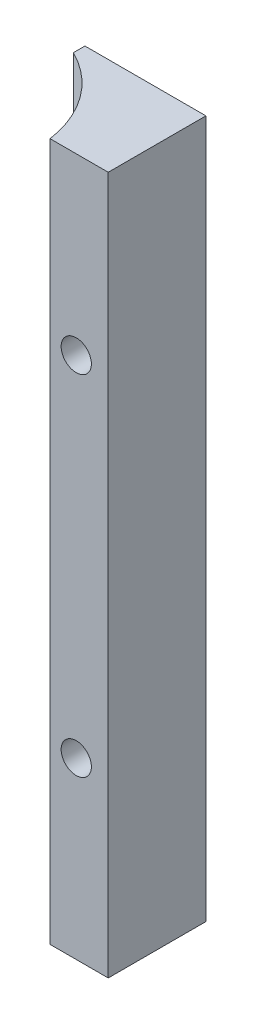
ISO-10303-21;
HEADER;
FILE_DESCRIPTION(('STEP AP214'),'2;1');
FILE_NAME('part.step','',(''),(''),'','','');
FILE_SCHEMA(('AUTOMOTIVE_DESIGN { 1 0 10303 214 1 1 1 1 }'));
ENDSEC;
DATA;
#1=APPLICATION_CONTEXT('core data for automotive mechanical design processes');
#2=APPLICATION_PROTOCOL_DEFINITION('international standard','automotive_design',2000,#1);
#3=PRODUCT_CONTEXT('',#1,'mechanical');
#4=PRODUCT('Part','Part','',(#3));
#5=PRODUCT_RELATED_PRODUCT_CATEGORY('part','',(#4));
#6=PRODUCT_DEFINITION_FORMATION('','',#4);
#7=PRODUCT_DEFINITION_CONTEXT('part definition',#1,'design');
#8=PRODUCT_DEFINITION('design','',#6,#7);
#9=PRODUCT_DEFINITION_SHAPE('','',#8);
#10=(LENGTH_UNIT() NAMED_UNIT(*) SI_UNIT(.MILLI.,.METRE.));
#11=(NAMED_UNIT(*) PLANE_ANGLE_UNIT() SI_UNIT($,.RADIAN.));
#12=(NAMED_UNIT(*) SI_UNIT($,.STERADIAN.) SOLID_ANGLE_UNIT());
#13=UNCERTAINTY_MEASURE_WITH_UNIT(LENGTH_MEASURE(1.E-05),#10,'distance_accuracy_value','');
#14=(GEOMETRIC_REPRESENTATION_CONTEXT(3) GLOBAL_UNCERTAINTY_ASSIGNED_CONTEXT((#13)) GLOBAL_UNIT_ASSIGNED_CONTEXT((#10,
#11,#12)) REPRESENTATION_CONTEXT('',''));
#15=CARTESIAN_POINT('',(0.,0.,0.));
#16=DIRECTION('',(0.,0.,1.));
#17=DIRECTION('',(1.,0.,0.));
#18=AXIS2_PLACEMENT_3D('',#15,#16,#17);
#19=CARTESIAN_POINT('',(-5.,60.,0.));
#20=DIRECTION('',(0.,0.,-1.));
#21=DIRECTION('',(-1.,0.,0.));
#22=AXIS2_PLACEMENT_3D('',#19,#20,#21);
#23=PLANE('',#22);
#24=CARTESIAN_POINT('',(-2.75,45.,0.));
#25=DIRECTION('',(0.,0.,1.));
#26=DIRECTION('',(1.,0.,0.));
#27=AXIS2_PLACEMENT_3D('',#24,#25,#26);
#28=CIRCLE('',#27,1.3);
#29=CARTESIAN_POINT('',(-1.45,45.,0.));
#30=VERTEX_POINT('',#29);
#31=EDGE_CURVE('E146',#30,#30,#28,.T.);
#32=ORIENTED_EDGE('',*,*,#31,.F.);
#33=EDGE_LOOP('',(#32));
#34=FACE_BOUND('',#33,.T.);
#35=CARTESIAN_POINT('',(-2.75,15.,0.));
#36=DIRECTION('',(0.,0.,1.));
#37=DIRECTION('',(1.,0.,0.));
#38=AXIS2_PLACEMENT_3D('',#35,#36,#37);
#39=CIRCLE('',#38,1.3);
#40=CARTESIAN_POINT('',(-1.45,15.,0.));
#41=VERTEX_POINT('',#40);
#42=EDGE_CURVE('E149',#41,#41,#39,.T.);
#43=ORIENTED_EDGE('',*,*,#42,.F.);
#44=EDGE_LOOP('',(#43));
#45=FACE_BOUND('',#44,.T.);
#46=DIRECTION('',(1.,0.,0.));
#47=VECTOR('',#46,1.);
#48=CARTESIAN_POINT('',(-5.,0.,0.));
#49=LINE('',#48,#47);
#50=CARTESIAN_POINT('',(-5.,0.,0.));
#51=VERTEX_POINT('',#50);
#52=CARTESIAN_POINT('',(0.,0.,0.));
#53=VERTEX_POINT('',#52);
#54=EDGE_CURVE('E110',#51,#53,#49,.T.);
#55=ORIENTED_EDGE('',*,*,#54,.T.);
#56=DIRECTION('',(0.,-1.,0.));
#57=VECTOR('',#56,1.);
#58=CARTESIAN_POINT('',(0.,60.,0.));
#59=LINE('',#58,#57);
#60=CARTESIAN_POINT('',(0.,60.,0.));
#61=VERTEX_POINT('',#60);
#62=EDGE_CURVE('E11',#61,#53,#59,.T.);
#63=ORIENTED_EDGE('',*,*,#62,.F.);
#64=DIRECTION('',(1.,0.,0.));
#65=VECTOR('',#64,1.);
#66=CARTESIAN_POINT('',(-5.,60.,0.));
#67=LINE('',#66,#65);
#68=CARTESIAN_POINT('',(-5.,60.,0.));
#69=VERTEX_POINT('',#68);
#70=EDGE_CURVE('E119',#69,#61,#67,.T.);
#71=ORIENTED_EDGE('',*,*,#70,.F.);
#72=DIRECTION('',(0.,-1.,0.));
#73=VECTOR('',#72,1.);
#74=CARTESIAN_POINT('',(-5.,60.,0.));
#75=LINE('',#74,#73);
#76=EDGE_CURVE('E106',#69,#51,#75,.T.);
#77=ORIENTED_EDGE('',*,*,#76,.T.);
#78=EDGE_LOOP('',(#55,#63,#71,#77));
#79=FACE_BOUND('',#78,.T.);
#80=ADVANCED_FACE('F36',(#34,#45,#79),#23,.F.);
#81=CARTESIAN_POINT('',(0.,60.,0.));
#82=DIRECTION('',(-1.,0.,0.));
#83=DIRECTION('',(0.,0.,1.));
#84=AXIS2_PLACEMENT_3D('',#81,#82,#83);
#85=PLANE('',#84);
#86=DIRECTION('',(0.,0.,-1.));
#87=VECTOR('',#86,1.);
#88=CARTESIAN_POINT('',(0.,0.,0.));
#89=LINE('',#88,#87);
#90=CARTESIAN_POINT('',(0.,0.,-8.4));
#91=VERTEX_POINT('',#90);
#92=EDGE_CURVE('E113',#53,#91,#89,.T.);
#93=ORIENTED_EDGE('',*,*,#92,.T.);
#94=DIRECTION('',(0.,-1.,0.));
#95=VECTOR('',#94,1.);
#96=CARTESIAN_POINT('',(0.,60.,-8.4));
#97=LINE('',#96,#95);
#98=CARTESIAN_POINT('',(0.,60.,-8.4));
#99=VERTEX_POINT('',#98);
#100=EDGE_CURVE('E44',#99,#91,#97,.T.);
#101=ORIENTED_EDGE('',*,*,#100,.F.);
#102=DIRECTION('',(0.,0.,-1.));
#103=VECTOR('',#102,1.);
#104=CARTESIAN_POINT('',(0.,60.,0.));
#105=LINE('',#104,#103);
#106=EDGE_CURVE('E86',#61,#99,#105,.T.);
#107=ORIENTED_EDGE('',*,*,#106,.F.);
#108=ORIENTED_EDGE('',*,*,#62,.T.);
#109=EDGE_LOOP('',(#93,#101,#107,#108));
#110=FACE_BOUND('',#109,.T.);
#111=ADVANCED_FACE('F138',(#110),#85,.F.);
#112=CARTESIAN_POINT('',(0.,60.,-8.4));
#113=DIRECTION('',(0.,0.,1.));
#114=DIRECTION('',(1.,0.,0.));
#115=AXIS2_PLACEMENT_3D('',#112,#113,#114);
#116=PLANE('',#115);
#117=CARTESIAN_POINT('',(-2.75,45.,-8.4));
#118=DIRECTION('',(0.,0.,1.));
#119=DIRECTION('',(1.,0.,0.));
#120=AXIS2_PLACEMENT_3D('',#117,#118,#119);
#121=CIRCLE('',#120,1.3);
#122=CARTESIAN_POINT('',(-1.45,45.,-8.4));
#123=VERTEX_POINT('',#122);
#124=EDGE_CURVE('E151',#123,#123,#121,.T.);
#125=ORIENTED_EDGE('',*,*,#124,.T.);
#126=EDGE_LOOP('',(#125));
#127=FACE_BOUND('',#126,.T.);
#128=CARTESIAN_POINT('',(-2.75,15.,-8.4));
#129=DIRECTION('',(0.,0.,1.));
#130=DIRECTION('',(1.,0.,0.));
#131=AXIS2_PLACEMENT_3D('',#128,#129,#130);
#132=CIRCLE('',#131,1.3);
#133=CARTESIAN_POINT('',(-1.45,15.,-8.4));
#134=VERTEX_POINT('',#133);
#135=EDGE_CURVE('E114',#134,#134,#132,.T.);
#136=ORIENTED_EDGE('',*,*,#135,.T.);
#137=EDGE_LOOP('',(#136));
#138=FACE_BOUND('',#137,.T.);
#139=DIRECTION('',(-1.,0.,0.));
#140=VECTOR('',#139,1.);
#141=CARTESIAN_POINT('',(0.,0.,-8.4));
#142=LINE('',#141,#140);
#143=CARTESIAN_POINT('',(-10.402546471274,0.,-8.4));
#144=VERTEX_POINT('',#143);
#145=EDGE_CURVE('E101',#91,#144,#142,.T.);
#146=ORIENTED_EDGE('',*,*,#145,.T.);
#147=DIRECTION('',(0.,-1.,0.));
#148=VECTOR('',#147,1.);
#149=CARTESIAN_POINT('',(-10.402546471274,60.,-8.4));
#150=LINE('',#149,#148);
#151=CARTESIAN_POINT('',(-10.402546471274,60.,-8.4));
#152=VERTEX_POINT('',#151);
#153=EDGE_CURVE('E98',#152,#144,#150,.T.);
#154=ORIENTED_EDGE('',*,*,#153,.F.);
#155=DIRECTION('',(-1.,0.,0.));
#156=VECTOR('',#155,1.);
#157=CARTESIAN_POINT('',(0.,60.,-8.4));
#158=LINE('',#157,#156);
#159=EDGE_CURVE('E90',#99,#152,#158,.T.);
#160=ORIENTED_EDGE('',*,*,#159,.F.);
#161=ORIENTED_EDGE('',*,*,#100,.T.);
#162=EDGE_LOOP('',(#146,#154,#160,#161));
#163=FACE_BOUND('',#162,.T.);
#164=ADVANCED_FACE('F99',(#127,#138,#163),#116,.F.);
#165=CARTESIAN_POINT('',(-10.402546471274,60.,-8.4));
#166=DIRECTION('',(1.,0.,0.));
#167=DIRECTION('',(0.,0.,-1.));
#168=AXIS2_PLACEMENT_3D('',#165,#166,#167);
#169=PLANE('',#168);
#170=DIRECTION('',(0.,0.,1.));
#171=VECTOR('',#170,1.);
#172=CARTESIAN_POINT('',(-10.402546471274,0.,-8.4));
#173=LINE('',#172,#171);
#174=CARTESIAN_POINT('',(-10.402546471274,0.,-7.4));
#175=VERTEX_POINT('',#174);
#176=EDGE_CURVE('E72',#144,#175,#173,.T.);
#177=ORIENTED_EDGE('',*,*,#176,.T.);
#178=DIRECTION('',(0.,-1.,0.));
#179=VECTOR('',#178,1.);
#180=CARTESIAN_POINT('',(-10.402546471274,60.,-7.4));
#181=LINE('',#180,#179);
#182=CARTESIAN_POINT('',(-10.402546471274,60.,-7.4));
#183=VERTEX_POINT('',#182);
#184=EDGE_CURVE('E102',#183,#175,#181,.T.);
#185=ORIENTED_EDGE('',*,*,#184,.F.);
#186=DIRECTION('',(0.,0.,1.));
#187=VECTOR('',#186,1.);
#188=CARTESIAN_POINT('',(-10.402546471274,60.,-8.4));
#189=LINE('',#188,#187);
#190=EDGE_CURVE('E94',#152,#183,#189,.T.);
#191=ORIENTED_EDGE('',*,*,#190,.F.);
#192=ORIENTED_EDGE('',*,*,#153,.T.);
#193=EDGE_LOOP('',(#177,#185,#191,#192));
#194=FACE_BOUND('',#193,.T.);
#195=ADVANCED_FACE('F104',(#194),#169,.F.);
#196=CARTESIAN_POINT('',(-14.7211110476118,60.,1.425));
#197=DIRECTION('',(0.,-1.,0.));
#198=DIRECTION('',(0.,0.,-1.));
#199=AXIS2_PLACEMENT_3D('',#196,#197,#198);
#200=CYLINDRICAL_SURFACE('',#199,9.825);
#201=CARTESIAN_POINT('',(-14.7211110476118,0.,1.425));
#202=DIRECTION('',(0.,-1.,0.));
#203=DIRECTION('',(0.,0.,-1.));
#204=AXIS2_PLACEMENT_3D('',#201,#202,#203);
#205=CIRCLE('',#204,9.825);
#206=EDGE_CURVE('E78',#175,#51,#205,.T.);
#207=ORIENTED_EDGE('',*,*,#206,.T.);
#208=ORIENTED_EDGE('',*,*,#76,.F.);
#209=CARTESIAN_POINT('',(-14.7211110476118,60.,1.425));
#210=DIRECTION('',(0.,-1.,0.));
#211=DIRECTION('',(0.,0.,-1.));
#212=AXIS2_PLACEMENT_3D('',#209,#210,#211);
#213=CIRCLE('',#212,9.825);
#214=EDGE_CURVE('E52',#183,#69,#213,.T.);
#215=ORIENTED_EDGE('',*,*,#214,.F.);
#216=ORIENTED_EDGE('',*,*,#184,.T.);
#217=EDGE_LOOP('',(#207,#208,#215,#216));
#218=FACE_BOUND('',#217,.T.);
#219=ADVANCED_FACE('F127',(#218),#200,.F.);
#220=CARTESIAN_POINT('',(-14.7211110476118,60.,1.425));
#221=DIRECTION('',(0.,-1.,0.));
#222=DIRECTION('',(0.,0.,-1.));
#223=AXIS2_PLACEMENT_3D('',#220,#221,#222);
#224=PLANE('',#223);
#225=ORIENTED_EDGE('',*,*,#70,.T.);
#226=ORIENTED_EDGE('',*,*,#106,.T.);
#227=ORIENTED_EDGE('',*,*,#159,.T.);
#228=ORIENTED_EDGE('',*,*,#190,.T.);
#229=ORIENTED_EDGE('',*,*,#214,.T.);
#230=EDGE_LOOP('',(#225,#226,#227,#228,#229));
#231=FACE_BOUND('',#230,.T.);
#232=ADVANCED_FACE('F92',(#231),#224,.F.);
#233=CARTESIAN_POINT('',(-14.7211110476118,0.,1.425));
#234=DIRECTION('',(0.,-1.,0.));
#235=DIRECTION('',(0.,0.,-1.));
#236=AXIS2_PLACEMENT_3D('',#233,#234,#235);
#237=PLANE('',#236);
#238=ORIENTED_EDGE('',*,*,#54,.F.);
#239=ORIENTED_EDGE('',*,*,#206,.F.);
#240=ORIENTED_EDGE('',*,*,#176,.F.);
#241=ORIENTED_EDGE('',*,*,#145,.F.);
#242=ORIENTED_EDGE('',*,*,#92,.F.);
#243=EDGE_LOOP('',(#238,#239,#240,#241,#242));
#244=FACE_BOUND('',#243,.T.);
#245=ADVANCED_FACE('F123',(#244),#237,.T.);
#246=CARTESIAN_POINT('',(-2.75,15.,0.));
#247=DIRECTION('',(0.,0.,1.));
#248=DIRECTION('',(1.,0.,0.));
#249=AXIS2_PLACEMENT_3D('',#246,#247,#248);
#250=CYLINDRICAL_SURFACE('',#249,1.3);
#251=ORIENTED_EDGE('',*,*,#135,.F.);
#252=EDGE_LOOP('',(#251));
#253=FACE_BOUND('',#252,.T.);
#254=ORIENTED_EDGE('',*,*,#42,.T.);
#255=EDGE_LOOP('',(#254));
#256=FACE_BOUND('',#255,.T.);
#257=ADVANCED_FACE('F162',(#253,#256),#250,.F.);
#258=CARTESIAN_POINT('',(-2.75,45.,0.));
#259=DIRECTION('',(0.,0.,1.));
#260=DIRECTION('',(1.,0.,0.));
#261=AXIS2_PLACEMENT_3D('',#258,#259,#260);
#262=CYLINDRICAL_SURFACE('',#261,1.3);
#263=ORIENTED_EDGE('',*,*,#124,.F.);
#264=EDGE_LOOP('',(#263));
#265=FACE_BOUND('',#264,.T.);
#266=ORIENTED_EDGE('',*,*,#31,.T.);
#267=EDGE_LOOP('',(#266));
#268=FACE_BOUND('',#267,.T.);
#269=ADVANCED_FACE('F160',(#265,#268),#262,.F.);
#270=CLOSED_SHELL('',(#80,#111,#164,#195,#219,#232,#245,#257,#269));
#271=MANIFOLD_SOLID_BREP('B2',#270);
#272=ADVANCED_BREP_SHAPE_REPRESENTATION('',(#18,#271),#14);
#273=SHAPE_DEFINITION_REPRESENTATION(#9,#272);
ENDSEC;
END-ISO-10303-21;
